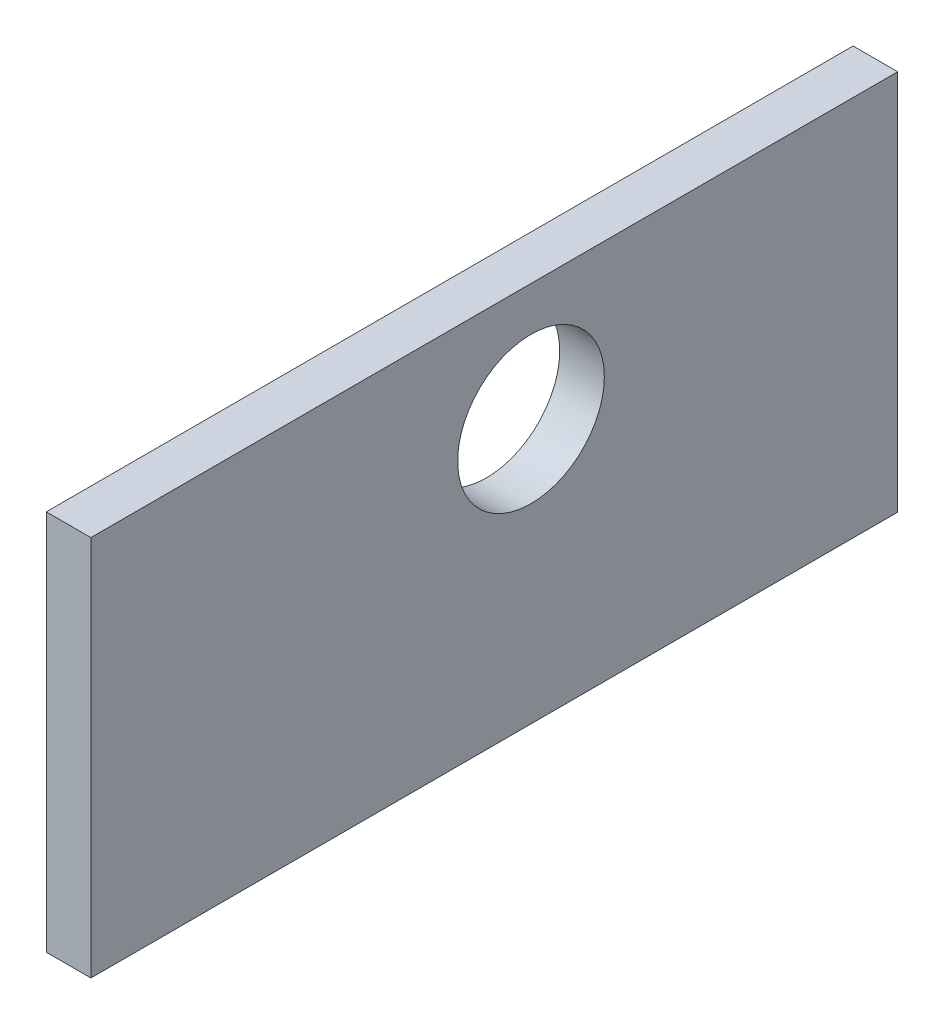
ISO-10303-21;
HEADER;
FILE_DESCRIPTION(('STEP AP214'),'2;1');
FILE_NAME('part.step','',(''),(''),'','','');
FILE_SCHEMA(('AUTOMOTIVE_DESIGN { 1 0 10303 214 1 1 1 1 }'));
ENDSEC;
DATA;
#1=APPLICATION_CONTEXT('core data for automotive mechanical design processes');
#2=APPLICATION_PROTOCOL_DEFINITION('international standard','automotive_design',2000,#1);
#3=PRODUCT_CONTEXT('',#1,'mechanical');
#4=PRODUCT('Part','Part','',(#3));
#5=PRODUCT_RELATED_PRODUCT_CATEGORY('part','',(#4));
#6=PRODUCT_DEFINITION_FORMATION('','',#4);
#7=PRODUCT_DEFINITION_CONTEXT('part definition',#1,'design');
#8=PRODUCT_DEFINITION('design','',#6,#7);
#9=PRODUCT_DEFINITION_SHAPE('','',#8);
#10=(LENGTH_UNIT() NAMED_UNIT(*) SI_UNIT(.MILLI.,.METRE.));
#11=(NAMED_UNIT(*) PLANE_ANGLE_UNIT() SI_UNIT($,.RADIAN.));
#12=(NAMED_UNIT(*) SI_UNIT($,.STERADIAN.) SOLID_ANGLE_UNIT());
#13=UNCERTAINTY_MEASURE_WITH_UNIT(LENGTH_MEASURE(1.E-05),#10,'distance_accuracy_value','');
#14=(GEOMETRIC_REPRESENTATION_CONTEXT(3) GLOBAL_UNCERTAINTY_ASSIGNED_CONTEXT((#13)) GLOBAL_UNIT_ASSIGNED_CONTEXT((#10,
#11,#12)) REPRESENTATION_CONTEXT('',''));
#15=CARTESIAN_POINT('',(0.,0.,0.));
#16=DIRECTION('',(0.,0.,1.));
#17=DIRECTION('',(1.,0.,0.));
#18=AXIS2_PLACEMENT_3D('',#15,#16,#17);
#19=CARTESIAN_POINT('',(4.826,0.,0.));
#20=DIRECTION('',(1.,0.,0.));
#21=DIRECTION('',(0.,0.,-1.));
#22=AXIS2_PLACEMENT_3D('',#19,#20,#21);
#23=PLANE('',#22);
#24=DIRECTION('',(0.,-1.,0.));
#25=VECTOR('',#24,1.);
#26=CARTESIAN_POINT('',(4.826,12.7,47.625));
#27=LINE('',#26,#25);
#28=CARTESIAN_POINT('',(4.826,12.7,47.625));
#29=VERTEX_POINT('',#28);
#30=CARTESIAN_POINT('',(4.826,-28.575,47.625));
#31=VERTEX_POINT('',#30);
#32=EDGE_CURVE('E95',#29,#31,#27,.T.);
#33=ORIENTED_EDGE('',*,*,#32,.T.);
#34=DIRECTION('',(0.,0.,-1.));
#35=VECTOR('',#34,1.);
#36=CARTESIAN_POINT('',(4.826,-28.575,47.625));
#37=LINE('',#36,#35);
#38=CARTESIAN_POINT('',(4.826,-28.575,-39.6875));
#39=VERTEX_POINT('',#38);
#40=EDGE_CURVE('E90',#31,#39,#37,.T.);
#41=ORIENTED_EDGE('',*,*,#40,.T.);
#42=DIRECTION('',(0.,1.,0.));
#43=VECTOR('',#42,1.);
#44=CARTESIAN_POINT('',(4.826,12.7,-39.6875));
#45=LINE('',#44,#43);
#46=CARTESIAN_POINT('',(4.826,12.7,-39.6875));
#47=VERTEX_POINT('',#46);
#48=EDGE_CURVE('E93',#39,#47,#45,.T.);
#49=ORIENTED_EDGE('',*,*,#48,.T.);
#50=DIRECTION('',(0.,0.,1.));
#51=VECTOR('',#50,1.);
#52=CARTESIAN_POINT('',(4.826,12.7,47.625));
#53=LINE('',#52,#51);
#54=EDGE_CURVE('E58',#47,#29,#53,.T.);
#55=ORIENTED_EDGE('',*,*,#54,.T.);
#56=EDGE_LOOP('',(#33,#41,#49,#55));
#57=FACE_BOUND('',#56,.T.);
#58=CARTESIAN_POINT('',(4.826,0.,0.));
#59=DIRECTION('',(1.,0.,0.));
#60=DIRECTION('',(0.,0.,-1.));
#61=AXIS2_PLACEMENT_3D('',#58,#59,#60);
#62=CIRCLE('',#61,7.9375);
#63=CARTESIAN_POINT('',(4.826,0.,-7.9375));
#64=VERTEX_POINT('',#63);
#65=EDGE_CURVE('E114',#64,#64,#62,.T.);
#66=ORIENTED_EDGE('',*,*,#65,.F.);
#67=EDGE_LOOP('',(#66));
#68=FACE_BOUND('',#67,.T.);
#69=ADVANCED_FACE('F41',(#57,#68),#23,.T.);
#70=CARTESIAN_POINT('',(0.,0.,0.));
#71=DIRECTION('',(1.,0.,0.));
#72=DIRECTION('',(0.,0.,-1.));
#73=AXIS2_PLACEMENT_3D('',#70,#71,#72);
#74=PLANE('',#73);
#75=DIRECTION('',(0.,-1.,0.));
#76=VECTOR('',#75,1.);
#77=CARTESIAN_POINT('',(0.,12.7,47.625));
#78=LINE('',#77,#76);
#79=CARTESIAN_POINT('',(0.,12.7,47.625));
#80=VERTEX_POINT('',#79);
#81=CARTESIAN_POINT('',(0.,-28.575,47.625));
#82=VERTEX_POINT('',#81);
#83=EDGE_CURVE('E111',#80,#82,#78,.T.);
#84=ORIENTED_EDGE('',*,*,#83,.F.);
#85=DIRECTION('',(0.,0.,1.));
#86=VECTOR('',#85,1.);
#87=CARTESIAN_POINT('',(0.,12.7,47.625));
#88=LINE('',#87,#86);
#89=CARTESIAN_POINT('',(0.,12.7,-39.6875));
#90=VERTEX_POINT('',#89);
#91=EDGE_CURVE('E83',#90,#80,#88,.T.);
#92=ORIENTED_EDGE('',*,*,#91,.F.);
#93=DIRECTION('',(0.,1.,0.));
#94=VECTOR('',#93,1.);
#95=CARTESIAN_POINT('',(0.,12.7,-39.6875));
#96=LINE('',#95,#94);
#97=CARTESIAN_POINT('',(0.,-28.575,-39.6875));
#98=VERTEX_POINT('',#97);
#99=EDGE_CURVE('E77',#98,#90,#96,.T.);
#100=ORIENTED_EDGE('',*,*,#99,.F.);
#101=DIRECTION('',(0.,0.,-1.));
#102=VECTOR('',#101,1.);
#103=CARTESIAN_POINT('',(0.,-28.575,47.625));
#104=LINE('',#103,#102);
#105=EDGE_CURVE('E99',#82,#98,#104,.T.);
#106=ORIENTED_EDGE('',*,*,#105,.F.);
#107=EDGE_LOOP('',(#84,#92,#100,#106));
#108=FACE_BOUND('',#107,.T.);
#109=CARTESIAN_POINT('',(0.,0.,0.));
#110=DIRECTION('',(1.,0.,0.));
#111=DIRECTION('',(0.,0.,-1.));
#112=AXIS2_PLACEMENT_3D('',#109,#110,#111);
#113=CIRCLE('',#112,7.9375);
#114=CARTESIAN_POINT('',(0.,0.,-7.9375));
#115=VERTEX_POINT('',#114);
#116=EDGE_CURVE('E129',#115,#115,#113,.T.);
#117=ORIENTED_EDGE('',*,*,#116,.T.);
#118=EDGE_LOOP('',(#117));
#119=FACE_BOUND('',#118,.T.);
#120=ADVANCED_FACE('F125',(#108,#119),#74,.F.);
#121=CARTESIAN_POINT('',(4.826,12.7,47.625));
#122=DIRECTION('',(0.,0.,-1.));
#123=DIRECTION('',(0.,1.,0.));
#124=AXIS2_PLACEMENT_3D('',#121,#122,#123);
#125=PLANE('',#124);
#126=ORIENTED_EDGE('',*,*,#83,.T.);
#127=DIRECTION('',(-1.,0.,0.));
#128=VECTOR('',#127,1.);
#129=CARTESIAN_POINT('',(4.826,-28.575,47.625));
#130=LINE('',#129,#128);
#131=EDGE_CURVE('E11',#31,#82,#130,.T.);
#132=ORIENTED_EDGE('',*,*,#131,.F.);
#133=ORIENTED_EDGE('',*,*,#32,.F.);
#134=DIRECTION('',(-1.,0.,0.));
#135=VECTOR('',#134,1.);
#136=CARTESIAN_POINT('',(4.826,12.7,47.625));
#137=LINE('',#136,#135);
#138=EDGE_CURVE('E107',#29,#80,#137,.T.);
#139=ORIENTED_EDGE('',*,*,#138,.T.);
#140=EDGE_LOOP('',(#126,#132,#133,#139));
#141=FACE_BOUND('',#140,.T.);
#142=ADVANCED_FACE('F43',(#141),#125,.F.);
#143=CARTESIAN_POINT('',(4.826,-28.575,47.625));
#144=DIRECTION('',(0.,1.,0.));
#145=DIRECTION('',(0.,0.,1.));
#146=AXIS2_PLACEMENT_3D('',#143,#144,#145);
#147=PLANE('',#146);
#148=ORIENTED_EDGE('',*,*,#105,.T.);
#149=DIRECTION('',(-1.,0.,0.));
#150=VECTOR('',#149,1.);
#151=CARTESIAN_POINT('',(4.826,-28.575,-39.6875));
#152=LINE('',#151,#150);
#153=EDGE_CURVE('E50',#39,#98,#152,.T.);
#154=ORIENTED_EDGE('',*,*,#153,.F.);
#155=ORIENTED_EDGE('',*,*,#40,.F.);
#156=ORIENTED_EDGE('',*,*,#131,.T.);
#157=EDGE_LOOP('',(#148,#154,#155,#156));
#158=FACE_BOUND('',#157,.T.);
#159=ADVANCED_FACE('F98',(#158),#147,.F.);
#160=CARTESIAN_POINT('',(4.826,12.7,-39.6875));
#161=DIRECTION('',(0.,0.,1.));
#162=DIRECTION('',(0.,-1.,0.));
#163=AXIS2_PLACEMENT_3D('',#160,#161,#162);
#164=PLANE('',#163);
#165=ORIENTED_EDGE('',*,*,#99,.T.);
#166=DIRECTION('',(-1.,0.,0.));
#167=VECTOR('',#166,1.);
#168=CARTESIAN_POINT('',(4.826,12.7,-39.6875));
#169=LINE('',#168,#167);
#170=EDGE_CURVE('E100',#47,#90,#169,.T.);
#171=ORIENTED_EDGE('',*,*,#170,.F.);
#172=ORIENTED_EDGE('',*,*,#48,.F.);
#173=ORIENTED_EDGE('',*,*,#153,.T.);
#174=EDGE_LOOP('',(#165,#171,#172,#173));
#175=FACE_BOUND('',#174,.T.);
#176=ADVANCED_FACE('F101',(#175),#164,.F.);
#177=CARTESIAN_POINT('',(4.826,12.7,47.625));
#178=DIRECTION('',(0.,-1.,0.));
#179=DIRECTION('',(0.,0.,-1.));
#180=AXIS2_PLACEMENT_3D('',#177,#178,#179);
#181=PLANE('',#180);
#182=ORIENTED_EDGE('',*,*,#91,.T.);
#183=ORIENTED_EDGE('',*,*,#138,.F.);
#184=ORIENTED_EDGE('',*,*,#54,.F.);
#185=ORIENTED_EDGE('',*,*,#170,.T.);
#186=EDGE_LOOP('',(#182,#183,#184,#185));
#187=FACE_BOUND('',#186,.T.);
#188=ADVANCED_FACE('F122',(#187),#181,.F.);
#189=CARTESIAN_POINT('',(4.826,0.,0.));
#190=DIRECTION('',(-1.,0.,0.));
#191=DIRECTION('',(0.,0.,1.));
#192=AXIS2_PLACEMENT_3D('',#189,#190,#191);
#193=CYLINDRICAL_SURFACE('',#192,7.9375);
#194=ORIENTED_EDGE('',*,*,#65,.T.);
#195=EDGE_LOOP('',(#194));
#196=FACE_BOUND('',#195,.T.);
#197=ORIENTED_EDGE('',*,*,#116,.F.);
#198=EDGE_LOOP('',(#197));
#199=FACE_BOUND('',#198,.T.);
#200=ADVANCED_FACE('F135',(#196,#199),#193,.F.);
#201=CLOSED_SHELL('',(#69,#120,#142,#159,#176,#188,#200));
#202=MANIFOLD_SOLID_BREP('B2',#201);
#203=ADVANCED_BREP_SHAPE_REPRESENTATION('',(#18,#202),#14);
#204=SHAPE_DEFINITION_REPRESENTATION(#9,#203);
ENDSEC;
END-ISO-10303-21;
